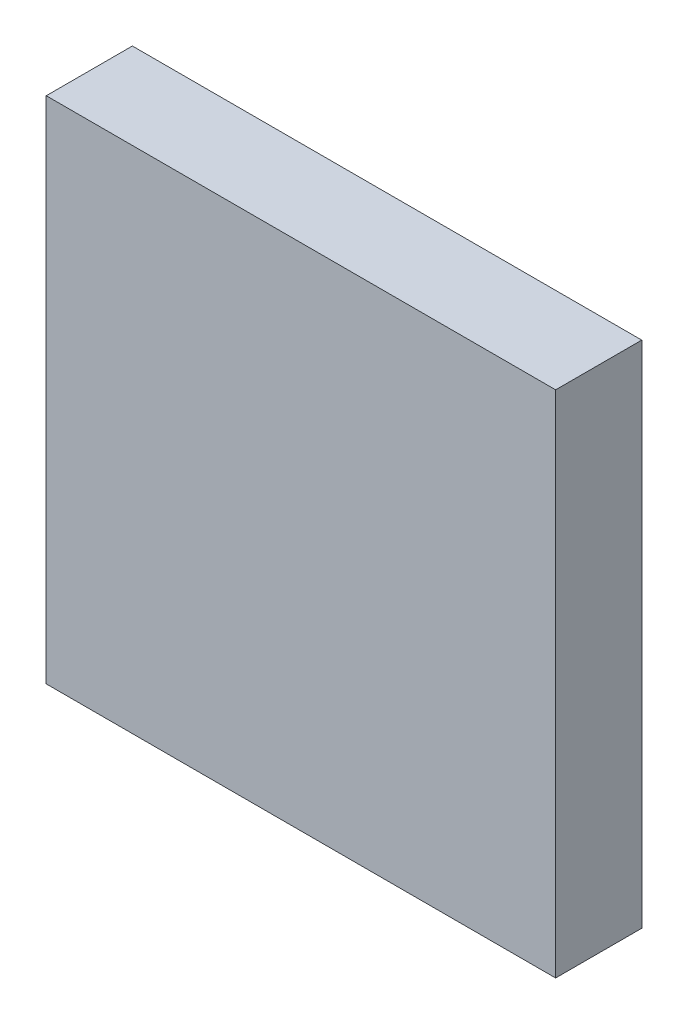
ISO-10303-21;
HEADER;
FILE_DESCRIPTION(('STEP AP214'),'2;1');
FILE_NAME('part.step','',(''),(''),'','','');
FILE_SCHEMA(('AUTOMOTIVE_DESIGN { 1 0 10303 214 1 1 1 1 }'));
ENDSEC;
DATA;
#1=APPLICATION_CONTEXT('core data for automotive mechanical design processes');
#2=APPLICATION_PROTOCOL_DEFINITION('international standard','automotive_design',2000,#1);
#3=PRODUCT_CONTEXT('',#1,'mechanical');
#4=PRODUCT('Part','Part','',(#3));
#5=PRODUCT_RELATED_PRODUCT_CATEGORY('part','',(#4));
#6=PRODUCT_DEFINITION_FORMATION('','',#4);
#7=PRODUCT_DEFINITION_CONTEXT('part definition',#1,'design');
#8=PRODUCT_DEFINITION('design','',#6,#7);
#9=PRODUCT_DEFINITION_SHAPE('','',#8);
#10=(LENGTH_UNIT() NAMED_UNIT(*) SI_UNIT(.MILLI.,.METRE.));
#11=(NAMED_UNIT(*) PLANE_ANGLE_UNIT() SI_UNIT($,.RADIAN.));
#12=(NAMED_UNIT(*) SI_UNIT($,.STERADIAN.) SOLID_ANGLE_UNIT());
#13=UNCERTAINTY_MEASURE_WITH_UNIT(LENGTH_MEASURE(1.E-05),#10,'distance_accuracy_value','');
#14=(GEOMETRIC_REPRESENTATION_CONTEXT(3) GLOBAL_UNCERTAINTY_ASSIGNED_CONTEXT((#13)) GLOBAL_UNIT_ASSIGNED_CONTEXT((#10,
#11,#12)) REPRESENTATION_CONTEXT('',''));
#15=CARTESIAN_POINT('',(0.,0.,0.));
#16=DIRECTION('',(0.,0.,1.));
#17=DIRECTION('',(1.,0.,0.));
#18=AXIS2_PLACEMENT_3D('',#15,#16,#17);
#19=CARTESIAN_POINT('',(70.6088050314466,-146.818789308176,36.5));
#20=DIRECTION('',(-1.,0.,0.));
#21=DIRECTION('',(0.,0.,1.));
#22=AXIS2_PLACEMENT_3D('',#19,#20,#21);
#23=PLANE('',#22);
#24=DIRECTION('',(0.,1.,0.));
#25=VECTOR('',#24,1.);
#26=CARTESIAN_POINT('',(70.6088050314466,-146.818789308176,0.));
#27=LINE('',#26,#25);
#28=CARTESIAN_POINT('',(70.6088050314466,-146.818789308176,0.));
#29=VERTEX_POINT('',#28);
#30=CARTESIAN_POINT('',(70.6088050314466,69.0812106918239,0.));
#31=VERTEX_POINT('',#30);
#32=EDGE_CURVE('E95',#29,#31,#27,.T.);
#33=ORIENTED_EDGE('',*,*,#32,.T.);
#34=DIRECTION('',(0.,0.,-1.));
#35=VECTOR('',#34,1.);
#36=CARTESIAN_POINT('',(70.6088050314466,69.0812106918239,36.5));
#37=LINE('',#36,#35);
#38=CARTESIAN_POINT('',(70.6088050314466,69.0812106918239,36.5));
#39=VERTEX_POINT('',#38);
#40=EDGE_CURVE('E11',#39,#31,#37,.T.);
#41=ORIENTED_EDGE('',*,*,#40,.F.);
#42=DIRECTION('',(0.,1.,0.));
#43=VECTOR('',#42,1.);
#44=CARTESIAN_POINT('',(70.6088050314466,-146.818789308176,36.5));
#45=LINE('',#44,#43);
#46=CARTESIAN_POINT('',(70.6088050314466,-146.818789308176,36.5));
#47=VERTEX_POINT('',#46);
#48=EDGE_CURVE('E83',#47,#39,#45,.T.);
#49=ORIENTED_EDGE('',*,*,#48,.F.);
#50=DIRECTION('',(0.,0.,-1.));
#51=VECTOR('',#50,1.);
#52=CARTESIAN_POINT('',(70.6088050314466,-146.818789308176,36.5));
#53=LINE('',#52,#51);
#54=EDGE_CURVE('E91',#47,#29,#53,.T.);
#55=ORIENTED_EDGE('',*,*,#54,.T.);
#56=EDGE_LOOP('',(#33,#41,#49,#55));
#57=FACE_BOUND('',#56,.T.);
#58=ADVANCED_FACE('F32',(#57),#23,.F.);
#59=CARTESIAN_POINT('',(-145.291194968553,69.0812106918239,36.5));
#60=DIRECTION('',(0.,-1.,0.));
#61=DIRECTION('',(0.,0.,-1.));
#62=AXIS2_PLACEMENT_3D('',#59,#60,#61);
#63=PLANE('',#62);
#64=DIRECTION('',(-1.,0.,0.));
#65=VECTOR('',#64,1.);
#66=CARTESIAN_POINT('',(-145.291194968553,69.0812106918239,0.));
#67=LINE('',#66,#65);
#68=CARTESIAN_POINT('',(-145.291194968553,69.0812106918239,0.));
#69=VERTEX_POINT('',#68);
#70=EDGE_CURVE('E87',#31,#69,#67,.T.);
#71=ORIENTED_EDGE('',*,*,#70,.T.);
#72=DIRECTION('',(0.,0.,-1.));
#73=VECTOR('',#72,1.);
#74=CARTESIAN_POINT('',(-145.291194968553,69.0812106918239,36.5));
#75=LINE('',#74,#73);
#76=CARTESIAN_POINT('',(-145.291194968553,69.0812106918239,36.5));
#77=VERTEX_POINT('',#76);
#78=EDGE_CURVE('E40',#77,#69,#75,.T.);
#79=ORIENTED_EDGE('',*,*,#78,.F.);
#80=DIRECTION('',(-1.,0.,0.));
#81=VECTOR('',#80,1.);
#82=CARTESIAN_POINT('',(-145.291194968553,69.0812106918239,36.5));
#83=LINE('',#82,#81);
#84=EDGE_CURVE('E78',#39,#77,#83,.T.);
#85=ORIENTED_EDGE('',*,*,#84,.F.);
#86=ORIENTED_EDGE('',*,*,#40,.T.);
#87=EDGE_LOOP('',(#71,#79,#85,#86));
#88=FACE_BOUND('',#87,.T.);
#89=ADVANCED_FACE('F86',(#88),#63,.F.);
#90=CARTESIAN_POINT('',(-145.291194968553,-146.818789308176,36.5));
#91=DIRECTION('',(1.,0.,0.));
#92=DIRECTION('',(0.,0.,-1.));
#93=AXIS2_PLACEMENT_3D('',#90,#91,#92);
#94=PLANE('',#93);
#95=DIRECTION('',(0.,-1.,0.));
#96=VECTOR('',#95,1.);
#97=CARTESIAN_POINT('',(-145.291194968553,-146.818789308176,0.));
#98=LINE('',#97,#96);
#99=CARTESIAN_POINT('',(-145.291194968553,-146.818789308176,0.));
#100=VERTEX_POINT('',#99);
#101=EDGE_CURVE('E65',#69,#100,#98,.T.);
#102=ORIENTED_EDGE('',*,*,#101,.T.);
#103=DIRECTION('',(0.,0.,-1.));
#104=VECTOR('',#103,1.);
#105=CARTESIAN_POINT('',(-145.291194968553,-146.818789308176,36.5));
#106=LINE('',#105,#104);
#107=CARTESIAN_POINT('',(-145.291194968553,-146.818789308176,36.5));
#108=VERTEX_POINT('',#107);
#109=EDGE_CURVE('E88',#108,#100,#106,.T.);
#110=ORIENTED_EDGE('',*,*,#109,.F.);
#111=DIRECTION('',(0.,-1.,0.));
#112=VECTOR('',#111,1.);
#113=CARTESIAN_POINT('',(-145.291194968553,-146.818789308176,36.5));
#114=LINE('',#113,#112);
#115=EDGE_CURVE('E81',#77,#108,#114,.T.);
#116=ORIENTED_EDGE('',*,*,#115,.F.);
#117=ORIENTED_EDGE('',*,*,#78,.T.);
#118=EDGE_LOOP('',(#102,#110,#116,#117));
#119=FACE_BOUND('',#118,.T.);
#120=ADVANCED_FACE('F89',(#119),#94,.F.);
#121=CARTESIAN_POINT('',(-145.291194968553,-146.818789308176,36.5));
#122=DIRECTION('',(0.,1.,0.));
#123=DIRECTION('',(0.,0.,1.));
#124=AXIS2_PLACEMENT_3D('',#121,#122,#123);
#125=PLANE('',#124);
#126=DIRECTION('',(1.,0.,0.));
#127=VECTOR('',#126,1.);
#128=CARTESIAN_POINT('',(-145.291194968553,-146.818789308176,0.));
#129=LINE('',#128,#127);
#130=EDGE_CURVE('E71',#100,#29,#129,.T.);
#131=ORIENTED_EDGE('',*,*,#130,.T.);
#132=ORIENTED_EDGE('',*,*,#54,.F.);
#133=DIRECTION('',(1.,0.,0.));
#134=VECTOR('',#133,1.);
#135=CARTESIAN_POINT('',(-145.291194968553,-146.818789308176,36.5));
#136=LINE('',#135,#134);
#137=EDGE_CURVE('E48',#108,#47,#136,.T.);
#138=ORIENTED_EDGE('',*,*,#137,.F.);
#139=ORIENTED_EDGE('',*,*,#109,.T.);
#140=EDGE_LOOP('',(#131,#132,#138,#139));
#141=FACE_BOUND('',#140,.T.);
#142=ADVANCED_FACE('F102',(#141),#125,.F.);
#143=CARTESIAN_POINT('',(0.,0.,36.5));
#144=DIRECTION('',(0.,0.,-1.));
#145=DIRECTION('',(-1.,0.,0.));
#146=AXIS2_PLACEMENT_3D('',#143,#144,#145);
#147=PLANE('',#146);
#148=ORIENTED_EDGE('',*,*,#48,.T.);
#149=ORIENTED_EDGE('',*,*,#84,.T.);
#150=ORIENTED_EDGE('',*,*,#115,.T.);
#151=ORIENTED_EDGE('',*,*,#137,.T.);
#152=EDGE_LOOP('',(#148,#149,#150,#151));
#153=FACE_BOUND('',#152,.T.);
#154=ADVANCED_FACE('F79',(#153),#147,.F.);
#155=CARTESIAN_POINT('',(0.,0.,0.));
#156=DIRECTION('',(0.,0.,-1.));
#157=DIRECTION('',(-1.,0.,0.));
#158=AXIS2_PLACEMENT_3D('',#155,#156,#157);
#159=PLANE('',#158);
#160=ORIENTED_EDGE('',*,*,#32,.F.);
#161=ORIENTED_EDGE('',*,*,#130,.F.);
#162=ORIENTED_EDGE('',*,*,#101,.F.);
#163=ORIENTED_EDGE('',*,*,#70,.F.);
#164=EDGE_LOOP('',(#160,#161,#162,#163));
#165=FACE_BOUND('',#164,.T.);
#166=ADVANCED_FACE('F105',(#165),#159,.T.);
#167=CLOSED_SHELL('',(#58,#89,#120,#142,#154,#166));
#168=MANIFOLD_SOLID_BREP('B2',#167);
#169=ADVANCED_BREP_SHAPE_REPRESENTATION('',(#18,#168),#14);
#170=SHAPE_DEFINITION_REPRESENTATION(#9,#169);
ENDSEC;
END-ISO-10303-21;
